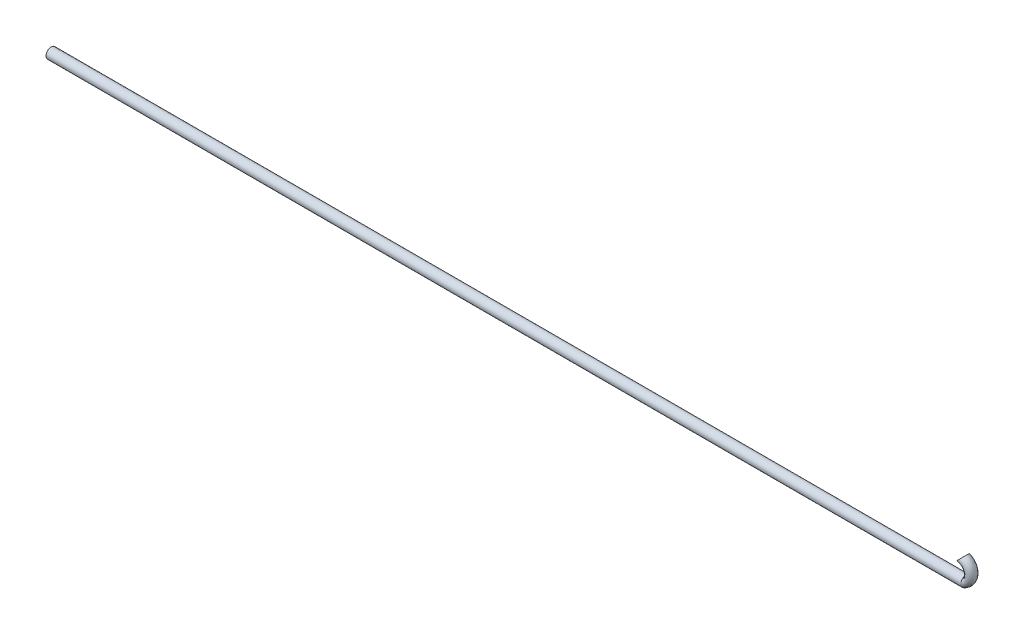
ISO-10303-21;
HEADER;
FILE_DESCRIPTION(('STEP AP214'),'2;1');
FILE_NAME('part.step','',(''),(''),'','','');
FILE_SCHEMA(('AUTOMOTIVE_DESIGN { 1 0 10303 214 1 1 1 1 }'));
ENDSEC;
DATA;
#1=APPLICATION_CONTEXT('core data for automotive mechanical design processes');
#2=APPLICATION_PROTOCOL_DEFINITION('international standard','automotive_design',2000,#1);
#3=PRODUCT_CONTEXT('',#1,'mechanical');
#4=PRODUCT('Part','Part','',(#3));
#5=PRODUCT_RELATED_PRODUCT_CATEGORY('part','',(#4));
#6=PRODUCT_DEFINITION_FORMATION('','',#4);
#7=PRODUCT_DEFINITION_CONTEXT('part definition',#1,'design');
#8=PRODUCT_DEFINITION('design','',#6,#7);
#9=PRODUCT_DEFINITION_SHAPE('','',#8);
#10=(LENGTH_UNIT() NAMED_UNIT(*) SI_UNIT(.MILLI.,.METRE.));
#11=(NAMED_UNIT(*) PLANE_ANGLE_UNIT() SI_UNIT($,.RADIAN.));
#12=(NAMED_UNIT(*) SI_UNIT($,.STERADIAN.) SOLID_ANGLE_UNIT());
#13=UNCERTAINTY_MEASURE_WITH_UNIT(LENGTH_MEASURE(1.E-05),#10,'distance_accuracy_value','');
#14=(GEOMETRIC_REPRESENTATION_CONTEXT(3) GLOBAL_UNCERTAINTY_ASSIGNED_CONTEXT((#13)) GLOBAL_UNIT_ASSIGNED_CONTEXT((#10,
#11,#12)) REPRESENTATION_CONTEXT('',''));
#15=CARTESIAN_POINT('',(0.,0.,0.));
#16=DIRECTION('',(0.,0.,1.));
#17=DIRECTION('',(1.,0.,0.));
#18=AXIS2_PLACEMENT_3D('',#15,#16,#17);
#19=CARTESIAN_POINT('',(0.,0.,0.));
#20=DIRECTION('',(1.,0.,0.));
#21=DIRECTION('',(0.,0.,-1.));
#22=AXIS2_PLACEMENT_3D('',#19,#20,#21);
#23=PLANE('',#22);
#24=CARTESIAN_POINT('',(0.,0.,0.));
#25=DIRECTION('',(1.,0.,0.));
#26=DIRECTION('',(0.,0.,-1.));
#27=AXIS2_PLACEMENT_3D('',#24,#25,#26);
#28=CIRCLE('',#27,0.6223);
#29=CARTESIAN_POINT('',(0.,0.,-0.6223));
#30=VERTEX_POINT('',#29);
#31=EDGE_CURVE('E34',#30,#30,#28,.T.);
#32=ORIENTED_EDGE('',*,*,#31,.F.);
#33=EDGE_LOOP('',(#32));
#34=FACE_BOUND('',#33,.T.);
#35=CARTESIAN_POINT('',(0.,0.,0.));
#36=DIRECTION('',(1.,0.,0.));
#37=DIRECTION('',(0.,0.,-1.));
#38=AXIS2_PLACEMENT_3D('',#35,#36,#37);
#39=CIRCLE('',#38,0.51435);
#40=CARTESIAN_POINT('',(0.,0.,-0.51435));
#41=VERTEX_POINT('',#40);
#42=EDGE_CURVE('E41',#41,#41,#39,.T.);
#43=ORIENTED_EDGE('',*,*,#42,.T.);
#44=EDGE_LOOP('',(#43));
#45=FACE_BOUND('',#44,.T.);
#46=ADVANCED_FACE('F30',(#34,#45),#23,.F.);
#47=CARTESIAN_POINT('',(110.,0.,0.));
#48=DIRECTION('',(-1.,0.,0.));
#49=DIRECTION('',(0.,0.,1.));
#50=AXIS2_PLACEMENT_3D('',#47,#48,#49);
#51=CYLINDRICAL_SURFACE('',#50,0.6223);
#52=CARTESIAN_POINT('',(110.,0.,0.));
#53=DIRECTION('',(1.,0.,0.));
#54=DIRECTION('',(0.,0.,-1.));
#55=AXIS2_PLACEMENT_3D('',#52,#53,#54);
#56=CIRCLE('',#55,0.6223);
#57=CARTESIAN_POINT('',(110.,0.,-0.6223));
#58=VERTEX_POINT('',#57);
#59=EDGE_CURVE('E10',#58,#58,#56,.T.);
#60=ORIENTED_EDGE('',*,*,#59,.F.);
#61=EDGE_LOOP('',(#60));
#62=FACE_BOUND('',#61,.T.);
#63=ORIENTED_EDGE('',*,*,#31,.T.);
#64=EDGE_LOOP('',(#63));
#65=FACE_BOUND('',#64,.T.);
#66=ADVANCED_FACE('F32',(#62,#65),#51,.T.);
#67=CARTESIAN_POINT('',(110.,0.,0.));
#68=DIRECTION('',(-1.,0.,0.));
#69=DIRECTION('',(0.,0.,1.));
#70=AXIS2_PLACEMENT_3D('',#67,#68,#69);
#71=CYLINDRICAL_SURFACE('',#70,0.51435);
#72=CARTESIAN_POINT('',(110.,0.,0.));
#73=DIRECTION('',(1.,0.,0.));
#74=DIRECTION('',(0.,0.,-1.));
#75=AXIS2_PLACEMENT_3D('',#72,#73,#74);
#76=CIRCLE('',#75,0.51435);
#77=CARTESIAN_POINT('',(110.,0.,-0.51435));
#78=VERTEX_POINT('',#77);
#79=EDGE_CURVE('E117',#78,#78,#76,.T.);
#80=ORIENTED_EDGE('',*,*,#79,.T.);
#81=EDGE_LOOP('',(#80));
#82=FACE_BOUND('',#81,.T.);
#83=ORIENTED_EDGE('',*,*,#42,.F.);
#84=EDGE_LOOP('',(#83));
#85=FACE_BOUND('',#84,.T.);
#86=ADVANCED_FACE('F61',(#82,#85),#71,.F.);
#87=CARTESIAN_POINT('',(109.649907133367,2.3233355361595,0.));
#88=DIRECTION('',(-0.711343861630949,0.702844158060639,0.));
#89=DIRECTION('',(0.,0.,-1.));
#90=AXIS2_PLACEMENT_3D('',#87,#88,#89);
#91=CIRCLE('',#90,0.51435);
#92=CARTESIAN_POINT('',(109.347859849454,1.08977668540232,0.));
#93=DIRECTION('',(0.,0.,-1.));
#94=AXIS1_PLACEMENT('',#92,#93);
#95=SURFACE_OF_REVOLUTION('',#91,#94);
#96=CARTESIAN_POINT('',(109.649907133367,2.3233355361595,-0.51435));
#97=VERTEX_POINT('',#96);
#98=EDGE_CURVE('E49',#97,#97,#91,.T.);
#99=ORIENTED_EDGE('',*,*,#98,.T.);
#100=EDGE_LOOP('',(#99));
#101=FACE_BOUND('',#100,.T.);
#102=ORIENTED_EDGE('',*,*,#79,.F.);
#103=EDGE_LOOP('',(#102));
#104=FACE_BOUND('',#103,.T.);
#105=ADVANCED_FACE('F58',(#101,#104),#95,.F.);
#106=CARTESIAN_POINT('',(109.649907133367,2.3233355361595,0.));
#107=DIRECTION('',(-0.711343861630949,0.702844158060639,0.));
#108=DIRECTION('',(0.,0.,-1.));
#109=AXIS2_PLACEMENT_3D('',#106,#107,#108);
#110=CIRCLE('',#109,0.6223);
#111=CARTESIAN_POINT('',(109.347859849454,1.08977668540232,0.));
#112=DIRECTION('',(0.,0.,-1.));
#113=AXIS1_PLACEMENT('',#111,#112);
#114=SURFACE_OF_REVOLUTION('',#110,#113);
#115=CARTESIAN_POINT('',(109.649907133367,2.3233355361595,-0.6223));
#116=VERTEX_POINT('',#115);
#117=EDGE_CURVE('E45',#116,#116,#110,.T.);
#118=ORIENTED_EDGE('',*,*,#117,.F.);
#119=EDGE_LOOP('',(#118));
#120=FACE_BOUND('',#119,.T.);
#121=ORIENTED_EDGE('',*,*,#59,.T.);
#122=EDGE_LOOP('',(#121));
#123=FACE_BOUND('',#122,.T.);
#124=ADVANCED_FACE('F53',(#120,#123),#114,.T.);
#125=CARTESIAN_POINT('',(109.649907133367,2.3233355361595,0.));
#126=DIRECTION('',(-0.711343861630949,0.702844158060639,0.));
#127=DIRECTION('',(0.,0.,-1.));
#128=AXIS2_PLACEMENT_3D('',#125,#126,#127);
#129=PLANE('',#128);
#130=ORIENTED_EDGE('',*,*,#98,.F.);
#131=EDGE_LOOP('',(#130));
#132=FACE_BOUND('',#131,.T.);
#133=ORIENTED_EDGE('',*,*,#117,.T.);
#134=EDGE_LOOP('',(#133));
#135=FACE_BOUND('',#134,.T.);
#136=ADVANCED_FACE('F57',(#132,#135),#129,.T.);
#137=CLOSED_SHELL('',(#46,#66,#86,#105,#124,#136));
#138=MANIFOLD_SOLID_BREP('B2',#137);
#139=ADVANCED_BREP_SHAPE_REPRESENTATION('',(#18,#138),#14);
#140=SHAPE_DEFINITION_REPRESENTATION(#9,#139);
ENDSEC;
END-ISO-10303-21;
